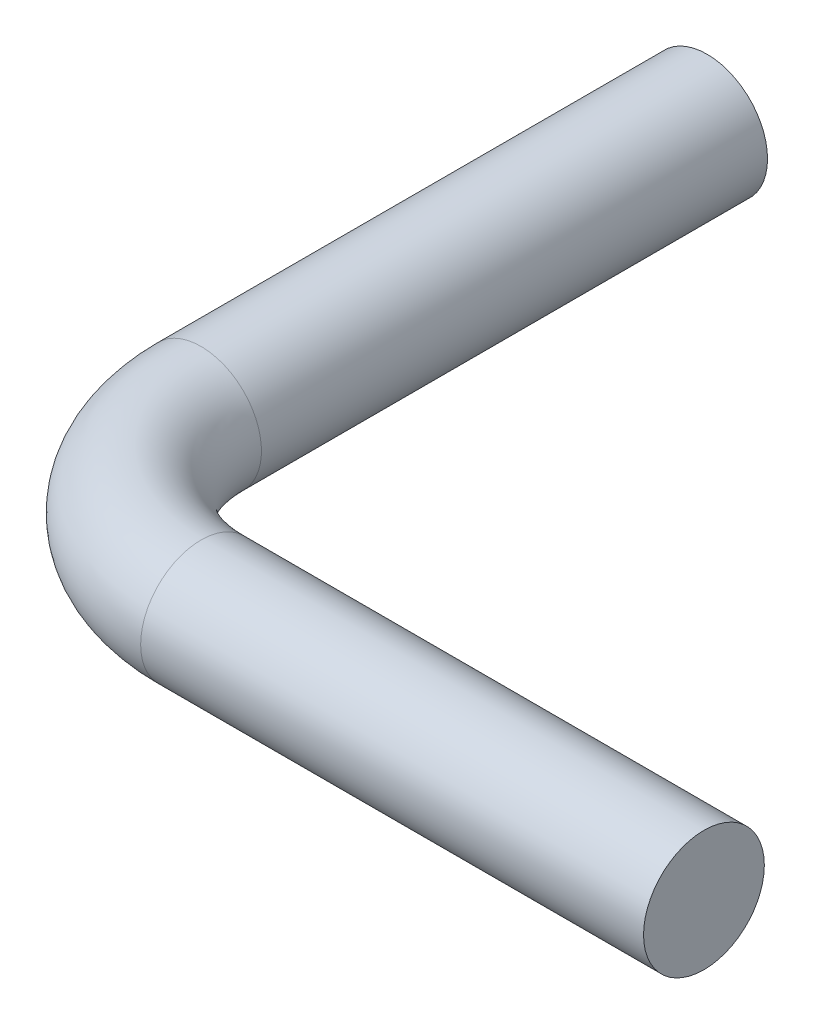
ISO-10303-21;
HEADER;
FILE_DESCRIPTION(('STEP AP214'),'2;1');
FILE_NAME('part.step','',(''),(''),'','','');
FILE_SCHEMA(('AUTOMOTIVE_DESIGN { 1 0 10303 214 1 1 1 1 }'));
ENDSEC;
DATA;
#1=APPLICATION_CONTEXT('core data for automotive mechanical design processes');
#2=APPLICATION_PROTOCOL_DEFINITION('international standard','automotive_design',2000,#1);
#3=PRODUCT_CONTEXT('',#1,'mechanical');
#4=PRODUCT('Part','Part','',(#3));
#5=PRODUCT_RELATED_PRODUCT_CATEGORY('part','',(#4));
#6=PRODUCT_DEFINITION_FORMATION('','',#4);
#7=PRODUCT_DEFINITION_CONTEXT('part definition',#1,'design');
#8=PRODUCT_DEFINITION('design','',#6,#7);
#9=PRODUCT_DEFINITION_SHAPE('','',#8);
#10=(LENGTH_UNIT() NAMED_UNIT(*) SI_UNIT(.MILLI.,.METRE.));
#11=(NAMED_UNIT(*) PLANE_ANGLE_UNIT() SI_UNIT($,.RADIAN.));
#12=(NAMED_UNIT(*) SI_UNIT($,.STERADIAN.) SOLID_ANGLE_UNIT());
#13=UNCERTAINTY_MEASURE_WITH_UNIT(LENGTH_MEASURE(1.E-05),#10,'distance_accuracy_value','');
#14=(GEOMETRIC_REPRESENTATION_CONTEXT(3) GLOBAL_UNCERTAINTY_ASSIGNED_CONTEXT((#13)) GLOBAL_UNIT_ASSIGNED_CONTEXT((#10,
#11,#12)) REPRESENTATION_CONTEXT('',''));
#15=CARTESIAN_POINT('',(0.,0.,0.));
#16=DIRECTION('',(0.,0.,1.));
#17=DIRECTION('',(1.,0.,0.));
#18=AXIS2_PLACEMENT_3D('',#15,#16,#17);
#19=CARTESIAN_POINT('',(0.,0.,0.));
#20=DIRECTION('',(1.,0.,0.));
#21=DIRECTION('',(0.,0.,-1.));
#22=AXIS2_PLACEMENT_3D('',#19,#20,#21);
#23=PLANE('',#22);
#24=CARTESIAN_POINT('',(0.,0.,0.));
#25=DIRECTION('',(1.,0.,0.));
#26=DIRECTION('',(0.,0.,-1.));
#27=AXIS2_PLACEMENT_3D('',#24,#25,#26);
#28=CIRCLE('',#27,1.80136565403902);
#29=CARTESIAN_POINT('',(0.,0.,-1.80136565403902));
#30=VERTEX_POINT('',#29);
#31=EDGE_CURVE('E45',#30,#30,#28,.T.);
#32=ORIENTED_EDGE('',*,*,#31,.T.);
#33=EDGE_LOOP('',(#32));
#34=FACE_BOUND('',#33,.T.);
#35=ADVANCED_FACE('F33',(#34),#23,.T.);
#36=CARTESIAN_POINT('',(-20.,0.,-20.0951896443939));
#37=DIRECTION('',(0.,0.,1.));
#38=DIRECTION('',(1.,0.,0.));
#39=AXIS2_PLACEMENT_3D('',#36,#37,#38);
#40=PLANE('',#39);
#41=CARTESIAN_POINT('',(-20.,0.,-20.0951896443939));
#42=DIRECTION('',(0.,0.,1.));
#43=DIRECTION('',(1.,0.,0.));
#44=AXIS2_PLACEMENT_3D('',#41,#42,#43);
#45=CIRCLE('',#44,1.80136565403902);
#46=CARTESIAN_POINT('',(-18.198634345961,0.,-20.0951896443939));
#47=VERTEX_POINT('',#46);
#48=EDGE_CURVE('E11',#47,#47,#45,.T.);
#49=ORIENTED_EDGE('',*,*,#48,.F.);
#50=EDGE_LOOP('',(#49));
#51=FACE_BOUND('',#50,.T.);
#52=ADVANCED_FACE('F51',(#51),#40,.F.);
#53=CARTESIAN_POINT('',(0.,0.,0.));
#54=DIRECTION('',(-1.,0.,0.));
#55=DIRECTION('',(0.,0.,1.));
#56=AXIS2_PLACEMENT_3D('',#53,#54,#55);
#57=CYLINDRICAL_SURFACE('',#56,1.80136565403902);
#58=CARTESIAN_POINT('',(-15.,0.,0.));
#59=DIRECTION('',(1.,0.,0.));
#60=DIRECTION('',(0.,0.,-1.));
#61=AXIS2_PLACEMENT_3D('',#58,#59,#60);
#62=CIRCLE('',#61,1.80136565403902);
#63=CARTESIAN_POINT('',(-15.,0.,1.80136565403902));
#64=VERTEX_POINT('',#63);
#65=EDGE_CURVE('E76',#64,#64,#62,.T.);
#66=ORIENTED_EDGE('',*,*,#65,.T.);
#67=EDGE_LOOP('',(#66));
#68=FACE_BOUND('',#67,.T.);
#69=ORIENTED_EDGE('',*,*,#31,.F.);
#70=EDGE_LOOP('',(#69));
#71=FACE_BOUND('',#70,.T.);
#72=ADVANCED_FACE('F53',(#68,#71),#57,.T.);
#73=CARTESIAN_POINT('',(-15.,0.,-5.));
#74=DIRECTION('',(0.,-1.,0.));
#75=DIRECTION('',(0.,0.,-1.));
#76=AXIS2_PLACEMENT_3D('',#73,#74,#75);
#77=TOROIDAL_SURFACE('',#76,5.,1.80136565403902);
#78=CARTESIAN_POINT('',(-20.,0.,-5.00000000000003));
#79=DIRECTION('',(0.,0.,1.));
#80=DIRECTION('',(1.,0.,0.));
#81=AXIS2_PLACEMENT_3D('',#78,#79,#80);
#82=CIRCLE('',#81,1.80136565403902);
#83=CARTESIAN_POINT('',(-21.801365654039,0.,-5.00000000000005));
#84=VERTEX_POINT('',#83);
#85=EDGE_CURVE('E40',#84,#84,#82,.T.);
#86=CARTESIAN_POINT('',(-15.,0.,-5.));
#87=DIRECTION('',(0.,-1.,0.));
#88=DIRECTION('',(0.,0.,-1.));
#89=AXIS2_PLACEMENT_3D('',#86,#87,#88);
#90=CIRCLE('',#89,6.80136565403902);
#91=EDGE_CURVE('',#64,#84,#90,.T.);
#92=ORIENTED_EDGE('',*,*,#65,.F.);
#93=ORIENTED_EDGE('',*,*,#85,.T.);
#94=ORIENTED_EDGE('',*,*,#91,.T.);
#95=ORIENTED_EDGE('',*,*,#91,.F.);
#96=EDGE_LOOP('',(#92,#94,#93,#95));
#97=FACE_BOUND('',#96,.T.);
#98=ADVANCED_FACE('F58',(#97),#77,.T.);
#99=CARTESIAN_POINT('',(-20.,0.,-5.00000000000003));
#100=DIRECTION('',(0.,0.,-1.));
#101=DIRECTION('',(-1.,0.,0.));
#102=AXIS2_PLACEMENT_3D('',#99,#100,#101);
#103=CYLINDRICAL_SURFACE('',#102,1.80136565403902);
#104=ORIENTED_EDGE('',*,*,#48,.T.);
#105=EDGE_LOOP('',(#104));
#106=FACE_BOUND('',#105,.T.);
#107=ORIENTED_EDGE('',*,*,#85,.F.);
#108=EDGE_LOOP('',(#107));
#109=FACE_BOUND('',#108,.T.);
#110=ADVANCED_FACE('F48',(#106,#109),#103,.T.);
#111=CLOSED_SHELL('',(#35,#52,#72,#98,#110));
#112=MANIFOLD_SOLID_BREP('B2',#111);
#113=ADVANCED_BREP_SHAPE_REPRESENTATION('',(#18,#112),#14);
#114=SHAPE_DEFINITION_REPRESENTATION(#9,#113);
ENDSEC;
END-ISO-10303-21;
